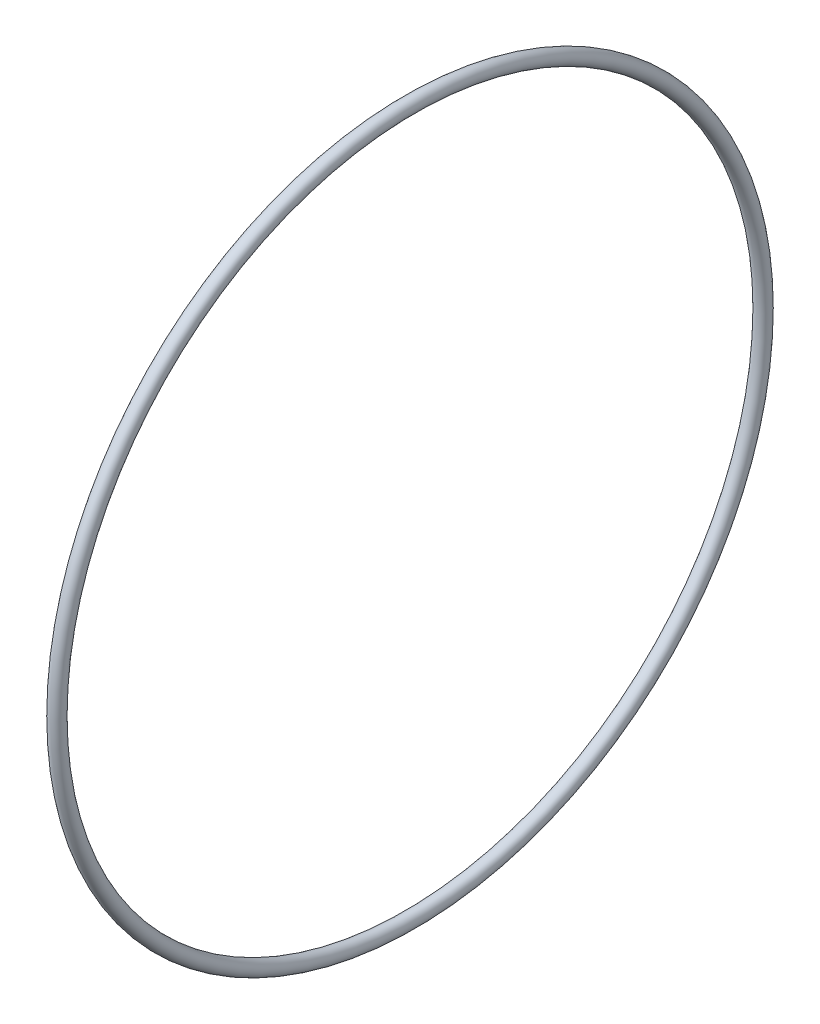
ISO-10303-21;
HEADER;
FILE_DESCRIPTION(('STEP AP214'),'2;1');
FILE_NAME('part.step','',(''),(''),'','','');
FILE_SCHEMA(('AUTOMOTIVE_DESIGN { 1 0 10303 214 1 1 1 1 }'));
ENDSEC;
DATA;
#1=APPLICATION_CONTEXT('core data for automotive mechanical design processes');
#2=APPLICATION_PROTOCOL_DEFINITION('international standard','automotive_design',2000,#1);
#3=PRODUCT_CONTEXT('',#1,'mechanical');
#4=PRODUCT('Part','Part','',(#3));
#5=PRODUCT_RELATED_PRODUCT_CATEGORY('part','',(#4));
#6=PRODUCT_DEFINITION_FORMATION('','',#4);
#7=PRODUCT_DEFINITION_CONTEXT('part definition',#1,'design');
#8=PRODUCT_DEFINITION('design','',#6,#7);
#9=PRODUCT_DEFINITION_SHAPE('','',#8);
#10=(LENGTH_UNIT() NAMED_UNIT(*) SI_UNIT(.MILLI.,.METRE.));
#11=(NAMED_UNIT(*) PLANE_ANGLE_UNIT() SI_UNIT($,.RADIAN.));
#12=(NAMED_UNIT(*) SI_UNIT($,.STERADIAN.) SOLID_ANGLE_UNIT());
#13=UNCERTAINTY_MEASURE_WITH_UNIT(LENGTH_MEASURE(1.E-05),#10,'distance_accuracy_value','');
#14=(GEOMETRIC_REPRESENTATION_CONTEXT(3) GLOBAL_UNCERTAINTY_ASSIGNED_CONTEXT((#13)) GLOBAL_UNIT_ASSIGNED_CONTEXT((#10,
#11,#12)) REPRESENTATION_CONTEXT('',''));
#15=CARTESIAN_POINT('',(0.,0.,0.));
#16=DIRECTION('',(0.,0.,1.));
#17=DIRECTION('',(1.,0.,0.));
#18=AXIS2_PLACEMENT_3D('',#15,#16,#17);
#19=CARTESIAN_POINT('',(0.,0.,0.));
#20=DIRECTION('',(-1.,0.,0.));
#21=DIRECTION('',(0.,0.,1.));
#22=AXIS2_PLACEMENT_3D('',#19,#20,#21);
#23=TOROIDAL_SURFACE('',#22,62.23,1.27);
#24=CARTESIAN_POINT('',(0.,0.,63.5));
#25=VERTEX_POINT('',#24);
#26=VERTEX_LOOP('',#25);
#27=FACE_BOUND('',#26,.T.);
#28=ADVANCED_FACE('F31',(#27),#23,.T.);
#29=CLOSED_SHELL('',(#28));
#30=MANIFOLD_SOLID_BREP('B2',#29);
#31=ADVANCED_BREP_SHAPE_REPRESENTATION('',(#18,#30),#14);
#32=SHAPE_DEFINITION_REPRESENTATION(#9,#31);
ENDSEC;
END-ISO-10303-21;
